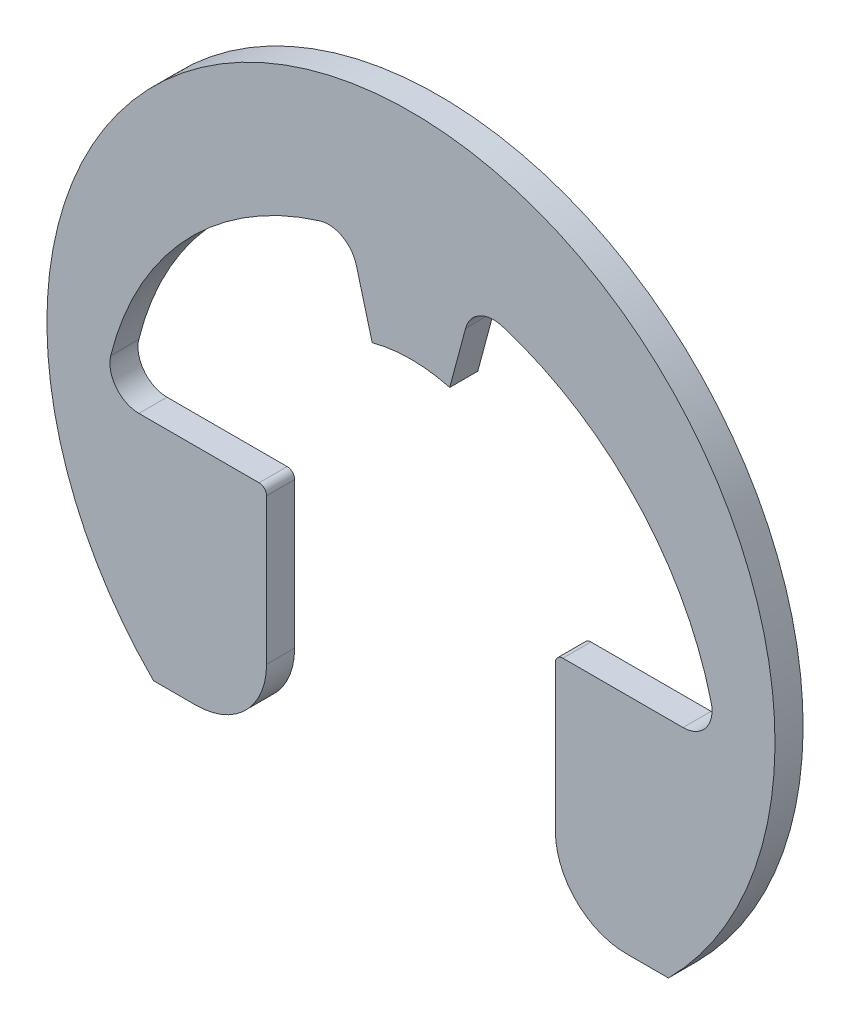
ISO-10303-21;
HEADER;
FILE_DESCRIPTION(('STEP AP214'),'2;1');
FILE_NAME('part.step','',(''),(''),'','','');
FILE_SCHEMA(('AUTOMOTIVE_DESIGN { 1 0 10303 214 1 1 1 1 }'));
ENDSEC;
DATA;
#1=APPLICATION_CONTEXT('core data for automotive mechanical design processes');
#2=APPLICATION_PROTOCOL_DEFINITION('international standard','automotive_design',2000,#1);
#3=PRODUCT_CONTEXT('',#1,'mechanical');
#4=PRODUCT('Part','Part','',(#3));
#5=PRODUCT_RELATED_PRODUCT_CATEGORY('part','',(#4));
#6=PRODUCT_DEFINITION_FORMATION('','',#4);
#7=PRODUCT_DEFINITION_CONTEXT('part definition',#1,'design');
#8=PRODUCT_DEFINITION('design','',#6,#7);
#9=PRODUCT_DEFINITION_SHAPE('','',#8);
#10=(LENGTH_UNIT() NAMED_UNIT(*) SI_UNIT(.MILLI.,.METRE.));
#11=(NAMED_UNIT(*) PLANE_ANGLE_UNIT() SI_UNIT($,.RADIAN.));
#12=(NAMED_UNIT(*) SI_UNIT($,.STERADIAN.) SOLID_ANGLE_UNIT());
#13=UNCERTAINTY_MEASURE_WITH_UNIT(LENGTH_MEASURE(1.E-05),#10,'distance_accuracy_value','');
#14=(GEOMETRIC_REPRESENTATION_CONTEXT(3) GLOBAL_UNCERTAINTY_ASSIGNED_CONTEXT((#13)) GLOBAL_UNIT_ASSIGNED_CONTEXT((#10,
#11,#12)) REPRESENTATION_CONTEXT('',''));
#15=CARTESIAN_POINT('',(0.,0.,0.));
#16=DIRECTION('',(0.,0.,1.));
#17=DIRECTION('',(1.,0.,0.));
#18=AXIS2_PLACEMENT_3D('',#15,#16,#17);
#19=CARTESIAN_POINT('',(-5.81258703439744,-0.0896076013005697,-0.6));
#20=DIRECTION('',(0.,0.,1.));
#21=DIRECTION('',(1.,0.,0.));
#22=AXIS2_PLACEMENT_3D('',#19,#20,#21);
#23=CYLINDRICAL_SURFACE('',#22,0.620024390243903);
#24=CARTESIAN_POINT('',(-5.81258703439744,-0.0896076013005697,0.));
#25=DIRECTION('',(0.,0.,-1.));
#26=DIRECTION('',(1.,0.,0.));
#27=AXIS2_PLACEMENT_3D('',#24,#25,#26);
#28=CIRCLE('',#27,0.620024390243903);
#29=CARTESIAN_POINT('',(-5.81258703439744,-0.709631991544472,0.));
#30=VERTEX_POINT('',#29);
#31=CARTESIAN_POINT('',(-6.41442249649734,0.0594706367367905,0.));
#32=VERTEX_POINT('',#31);
#33=EDGE_CURVE('E202',#30,#32,#28,.T.);
#34=ORIENTED_EDGE('',*,*,#33,.F.);
#35=DIRECTION('',(0.,0.,1.));
#36=VECTOR('',#35,1.);
#37=CARTESIAN_POINT('',(-5.81258703439744,-0.709631991544472,-0.6));
#38=LINE('',#37,#36);
#39=CARTESIAN_POINT('',(-5.81258703439744,-0.709631991544472,-0.6));
#40=VERTEX_POINT('',#39);
#41=EDGE_CURVE('E11',#40,#30,#38,.T.);
#42=ORIENTED_EDGE('',*,*,#41,.F.);
#43=CARTESIAN_POINT('',(-5.81258703439744,-0.0896076013005697,-0.6));
#44=DIRECTION('',(0.,0.,-1.));
#45=DIRECTION('',(1.,0.,0.));
#46=AXIS2_PLACEMENT_3D('',#43,#44,#45);
#47=CIRCLE('',#46,0.620024390243903);
#48=CARTESIAN_POINT('',(-6.41442249649734,0.0594706367367905,-0.6));
#49=VERTEX_POINT('',#48);
#50=EDGE_CURVE('E258',#40,#49,#47,.T.);
#51=ORIENTED_EDGE('',*,*,#50,.T.);
#52=DIRECTION('',(0.,0.,1.));
#53=VECTOR('',#52,1.);
#54=CARTESIAN_POINT('',(-6.41442249649734,0.0594706367367905,-0.6));
#55=LINE('',#54,#53);
#56=EDGE_CURVE('E36',#49,#32,#55,.T.);
#57=ORIENTED_EDGE('',*,*,#56,.T.);
#58=EDGE_LOOP('',(#34,#42,#51,#57));
#59=FACE_BOUND('',#58,.T.);
#60=ADVANCED_FACE('F33',(#59),#23,.F.);
#61=CARTESIAN_POINT('',(-3.24551077633127,-0.709631991544472,-0.6));
#62=DIRECTION('',(0.,1.,0.));
#63=DIRECTION('',(-1.,0.,0.));
#64=AXIS2_PLACEMENT_3D('',#61,#62,#63);
#65=PLANE('',#64);
#66=DIRECTION('',(-1.,0.,0.));
#67=VECTOR('',#66,1.);
#68=CARTESIAN_POINT('',(-3.24551077633127,-0.709631991544472,0.));
#69=LINE('',#68,#67);
#70=CARTESIAN_POINT('',(-3.24551077633127,-0.709631991544472,0.));
#71=VERTEX_POINT('',#70);
#72=EDGE_CURVE('E256',#71,#30,#69,.T.);
#73=ORIENTED_EDGE('',*,*,#72,.F.);
#74=DIRECTION('',(0.,0.,1.));
#75=VECTOR('',#74,1.);
#76=CARTESIAN_POINT('',(-3.24551077633127,-0.709631991544472,-0.6));
#77=LINE('',#76,#75);
#78=CARTESIAN_POINT('',(-3.24551077633127,-0.709631991544472,-0.6));
#79=VERTEX_POINT('',#78);
#80=EDGE_CURVE('E42',#79,#71,#77,.T.);
#81=ORIENTED_EDGE('',*,*,#80,.F.);
#82=DIRECTION('',(-1.,0.,0.));
#83=VECTOR('',#82,1.);
#84=CARTESIAN_POINT('',(-3.24551077633127,-0.709631991544472,-0.6));
#85=LINE('',#84,#83);
#86=EDGE_CURVE('E192',#79,#40,#85,.T.);
#87=ORIENTED_EDGE('',*,*,#86,.T.);
#88=ORIENTED_EDGE('',*,*,#41,.T.);
#89=EDGE_LOOP('',(#73,#81,#87,#88));
#90=FACE_BOUND('',#89,.T.);
#91=ADVANCED_FACE('F294',(#90),#65,.T.);
#92=CARTESIAN_POINT('',(-3.24551077633127,-0.869631991544472,-0.6));
#93=DIRECTION('',(0.,0.,1.));
#94=DIRECTION('',(1.,0.,0.));
#95=AXIS2_PLACEMENT_3D('',#92,#93,#94);
#96=CYLINDRICAL_SURFACE('',#95,0.16);
#97=CARTESIAN_POINT('',(-3.24551077633127,-0.869631991544472,0.));
#98=DIRECTION('',(0.,0.,1.));
#99=DIRECTION('',(1.,0.,0.));
#100=AXIS2_PLACEMENT_3D('',#97,#98,#99);
#101=CIRCLE('',#100,0.16);
#102=CARTESIAN_POINT('',(-3.08551077633127,-0.869631991544472,0.));
#103=VERTEX_POINT('',#102);
#104=EDGE_CURVE('E179',#103,#71,#101,.T.);
#105=ORIENTED_EDGE('',*,*,#104,.F.);
#106=DIRECTION('',(0.,0.,1.));
#107=VECTOR('',#106,1.);
#108=CARTESIAN_POINT('',(-3.08551077633127,-0.869631991544472,-0.6));
#109=LINE('',#108,#107);
#110=CARTESIAN_POINT('',(-3.08551077633127,-0.869631991544472,-0.6));
#111=VERTEX_POINT('',#110);
#112=EDGE_CURVE('E174',#111,#103,#109,.T.);
#113=ORIENTED_EDGE('',*,*,#112,.F.);
#114=CARTESIAN_POINT('',(-3.24551077633127,-0.869631991544472,-0.6));
#115=DIRECTION('',(0.,0.,1.));
#116=DIRECTION('',(1.,0.,0.));
#117=AXIS2_PLACEMENT_3D('',#114,#115,#116);
#118=CIRCLE('',#117,0.16);
#119=EDGE_CURVE('E177',#111,#79,#118,.T.);
#120=ORIENTED_EDGE('',*,*,#119,.T.);
#121=ORIENTED_EDGE('',*,*,#80,.T.);
#122=EDGE_LOOP('',(#105,#113,#120,#121));
#123=FACE_BOUND('',#122,.T.);
#124=ADVANCED_FACE('F176',(#123),#96,.T.);
#125=CARTESIAN_POINT('',(-3.08551077633127,-0.869631991544472,-0.6));
#126=DIRECTION('',(1.,0.,0.));
#127=DIRECTION('',(0.,1.,0.));
#128=AXIS2_PLACEMENT_3D('',#125,#126,#127);
#129=PLANE('',#128);
#130=DIRECTION('',(0.,1.,0.));
#131=VECTOR('',#130,1.);
#132=CARTESIAN_POINT('',(-3.08551077633127,-0.869631991544472,0.));
#133=LINE('',#132,#131);
#134=CARTESIAN_POINT('',(-3.08551077633127,-3.98946153040072,0.));
#135=VERTEX_POINT('',#134);
#136=EDGE_CURVE('E253',#135,#103,#133,.T.);
#137=ORIENTED_EDGE('',*,*,#136,.F.);
#138=DIRECTION('',(0.,0.,1.));
#139=VECTOR('',#138,1.);
#140=CARTESIAN_POINT('',(-3.08551077633127,-3.98946153040072,-0.6));
#141=LINE('',#140,#139);
#142=CARTESIAN_POINT('',(-3.08551077633127,-3.98946153040072,-0.6));
#143=VERTEX_POINT('',#142);
#144=EDGE_CURVE('E184',#143,#135,#141,.T.);
#145=ORIENTED_EDGE('',*,*,#144,.F.);
#146=DIRECTION('',(0.,1.,0.));
#147=VECTOR('',#146,1.);
#148=CARTESIAN_POINT('',(-3.08551077633127,-0.869631991544472,-0.6));
#149=LINE('',#148,#147);
#150=EDGE_CURVE('E190',#143,#111,#149,.T.);
#151=ORIENTED_EDGE('',*,*,#150,.T.);
#152=ORIENTED_EDGE('',*,*,#112,.T.);
#153=EDGE_LOOP('',(#137,#145,#151,#152));
#154=FACE_BOUND('',#153,.T.);
#155=ADVANCED_FACE('F194',(#154),#129,.T.);
#156=CARTESIAN_POINT('',(-4.59653516657517,-3.98946153040072,-0.6));
#157=DIRECTION('',(0.,0.,1.));
#158=DIRECTION('',(1.,0.,0.));
#159=AXIS2_PLACEMENT_3D('',#156,#157,#158);
#160=CYLINDRICAL_SURFACE('',#159,1.5110243902439);
#161=CARTESIAN_POINT('',(-4.59653516657517,-3.98946153040072,0.));
#162=DIRECTION('',(0.,0.,1.));
#163=DIRECTION('',(1.,0.,0.));
#164=AXIS2_PLACEMENT_3D('',#161,#162,#163);
#165=CIRCLE('',#164,1.5110243902439);
#166=CARTESIAN_POINT('',(-4.59653516657517,-5.50048592064462,0.));
#167=VERTEX_POINT('',#166);
#168=EDGE_CURVE('E250',#167,#135,#165,.T.);
#169=ORIENTED_EDGE('',*,*,#168,.F.);
#170=DIRECTION('',(0.,0.,1.));
#171=VECTOR('',#170,1.);
#172=CARTESIAN_POINT('',(-4.59653516657517,-5.50048592064462,-0.6));
#173=LINE('',#172,#171);
#174=CARTESIAN_POINT('',(-4.59653516657517,-5.50048592064462,-0.6));
#175=VERTEX_POINT('',#174);
#176=EDGE_CURVE('E262',#175,#167,#173,.T.);
#177=ORIENTED_EDGE('',*,*,#176,.F.);
#178=CARTESIAN_POINT('',(-4.59653516657517,-3.98946153040072,-0.6));
#179=DIRECTION('',(0.,0.,1.));
#180=DIRECTION('',(1.,0.,0.));
#181=AXIS2_PLACEMENT_3D('',#178,#179,#180);
#182=CIRCLE('',#181,1.5110243902439);
#183=EDGE_CURVE('E195',#175,#143,#182,.T.);
#184=ORIENTED_EDGE('',*,*,#183,.T.);
#185=ORIENTED_EDGE('',*,*,#144,.T.);
#186=EDGE_LOOP('',(#169,#177,#184,#185));
#187=FACE_BOUND('',#186,.T.);
#188=ADVANCED_FACE('F307',(#187),#160,.T.);
#189=CARTESIAN_POINT('',(-4.59653516657517,-5.50048592064462,-0.6));
#190=DIRECTION('',(0.,-1.,0.));
#191=DIRECTION('',(1.,0.,0.));
#192=AXIS2_PLACEMENT_3D('',#189,#190,#191);
#193=PLANE('',#192);
#194=DIRECTION('',(1.,0.,0.));
#195=VECTOR('',#194,1.);
#196=CARTESIAN_POINT('',(-4.59653516657517,-5.50048592064462,0.));
#197=LINE('',#196,#195);
#198=CARTESIAN_POINT('',(-5.50048592064462,-5.50048592064463,0.));
#199=VERTEX_POINT('',#198);
#200=EDGE_CURVE('E247',#199,#167,#197,.T.);
#201=ORIENTED_EDGE('',*,*,#200,.F.);
#202=DIRECTION('',(0.,0.,1.));
#203=VECTOR('',#202,1.);
#204=CARTESIAN_POINT('',(-5.50048592064462,-5.50048592064463,-0.6));
#205=LINE('',#204,#203);
#206=CARTESIAN_POINT('',(-5.50048592064462,-5.50048592064463,-0.6));
#207=VERTEX_POINT('',#206);
#208=EDGE_CURVE('E264',#207,#199,#205,.T.);
#209=ORIENTED_EDGE('',*,*,#208,.F.);
#210=DIRECTION('',(1.,0.,0.));
#211=VECTOR('',#210,1.);
#212=CARTESIAN_POINT('',(-4.59653516657517,-5.50048592064462,-0.6));
#213=LINE('',#212,#211);
#214=EDGE_CURVE('E197',#207,#175,#213,.T.);
#215=ORIENTED_EDGE('',*,*,#214,.T.);
#216=ORIENTED_EDGE('',*,*,#176,.T.);
#217=EDGE_LOOP('',(#201,#209,#215,#216));
#218=FACE_BOUND('',#217,.T.);
#219=ADVANCED_FACE('F310',(#218),#193,.T.);
#220=CARTESIAN_POINT('',(0.,0.,-0.6));
#221=DIRECTION('',(0.,0.,1.));
#222=DIRECTION('',(1.,0.,0.));
#223=AXIS2_PLACEMENT_3D('',#220,#221,#222);
#224=CYLINDRICAL_SURFACE('',#223,7.77886178861788);
#225=CARTESIAN_POINT('',(0.,0.,0.));
#226=DIRECTION('',(0.,0.,1.));
#227=DIRECTION('',(1.,0.,0.));
#228=AXIS2_PLACEMENT_3D('',#225,#226,#227);
#229=CIRCLE('',#228,7.77886178861788);
#230=CARTESIAN_POINT('',(5.50048592064462,-5.50048592064462,0.));
#231=VERTEX_POINT('',#230);
#232=EDGE_CURVE('E244',#231,#199,#229,.T.);
#233=ORIENTED_EDGE('',*,*,#232,.F.);
#234=DIRECTION('',(0.,0.,1.));
#235=VECTOR('',#234,1.);
#236=CARTESIAN_POINT('',(5.50048592064462,-5.50048592064462,-0.6));
#237=LINE('',#236,#235);
#238=CARTESIAN_POINT('',(5.50048592064462,-5.50048592064462,-0.6));
#239=VERTEX_POINT('',#238);
#240=EDGE_CURVE('E266',#239,#231,#237,.T.);
#241=ORIENTED_EDGE('',*,*,#240,.F.);
#242=CARTESIAN_POINT('',(0.,0.,-0.6));
#243=DIRECTION('',(0.,0.,1.));
#244=DIRECTION('',(1.,0.,0.));
#245=AXIS2_PLACEMENT_3D('',#242,#243,#244);
#246=CIRCLE('',#245,7.77886178861788);
#247=EDGE_CURVE('E549',#239,#207,#246,.T.);
#248=ORIENTED_EDGE('',*,*,#247,.T.);
#249=ORIENTED_EDGE('',*,*,#208,.T.);
#250=EDGE_LOOP('',(#233,#241,#248,#249));
#251=FACE_BOUND('',#250,.T.);
#252=ADVANCED_FACE('F314',(#251),#224,.T.);
#253=CARTESIAN_POINT('',(5.50048592064462,-5.50048592064462,-0.6));
#254=DIRECTION('',(0.,-1.,0.));
#255=DIRECTION('',(1.,0.,0.));
#256=AXIS2_PLACEMENT_3D('',#253,#254,#255);
#257=PLANE('',#256);
#258=DIRECTION('',(1.,0.,0.));
#259=VECTOR('',#258,1.);
#260=CARTESIAN_POINT('',(5.50048592064462,-5.50048592064462,0.));
#261=LINE('',#260,#259);
#262=CARTESIAN_POINT('',(4.59653516657517,-5.50048592064462,0.));
#263=VERTEX_POINT('',#262);
#264=EDGE_CURVE('E241',#263,#231,#261,.T.);
#265=ORIENTED_EDGE('',*,*,#264,.F.);
#266=DIRECTION('',(0.,0.,1.));
#267=VECTOR('',#266,1.);
#268=CARTESIAN_POINT('',(4.59653516657517,-5.50048592064462,-0.6));
#269=LINE('',#268,#267);
#270=CARTESIAN_POINT('',(4.59653516657517,-5.50048592064462,-0.6));
#271=VERTEX_POINT('',#270);
#272=EDGE_CURVE('E268',#271,#263,#269,.T.);
#273=ORIENTED_EDGE('',*,*,#272,.F.);
#274=DIRECTION('',(1.,0.,0.));
#275=VECTOR('',#274,1.);
#276=CARTESIAN_POINT('',(5.50048592064462,-5.50048592064462,-0.6));
#277=LINE('',#276,#275);
#278=EDGE_CURVE('E542',#271,#239,#277,.T.);
#279=ORIENTED_EDGE('',*,*,#278,.T.);
#280=ORIENTED_EDGE('',*,*,#240,.T.);
#281=EDGE_LOOP('',(#265,#273,#279,#280));
#282=FACE_BOUND('',#281,.T.);
#283=ADVANCED_FACE('F318',(#282),#257,.T.);
#284=CARTESIAN_POINT('',(4.59653516657517,-3.98946153040072,-0.6));
#285=DIRECTION('',(0.,0.,1.));
#286=DIRECTION('',(1.,0.,0.));
#287=AXIS2_PLACEMENT_3D('',#284,#285,#286);
#288=CYLINDRICAL_SURFACE('',#287,1.5110243902439);
#289=CARTESIAN_POINT('',(4.59653516657517,-3.98946153040072,0.));
#290=DIRECTION('',(0.,0.,1.));
#291=DIRECTION('',(1.,0.,0.));
#292=AXIS2_PLACEMENT_3D('',#289,#290,#291);
#293=CIRCLE('',#292,1.5110243902439);
#294=CARTESIAN_POINT('',(3.08551077633127,-3.98946153040072,0.));
#295=VERTEX_POINT('',#294);
#296=EDGE_CURVE('E238',#295,#263,#293,.T.);
#297=ORIENTED_EDGE('',*,*,#296,.F.);
#298=DIRECTION('',(0.,0.,1.));
#299=VECTOR('',#298,1.);
#300=CARTESIAN_POINT('',(3.08551077633127,-3.98946153040072,-0.6));
#301=LINE('',#300,#299);
#302=CARTESIAN_POINT('',(3.08551077633127,-3.98946153040072,-0.6));
#303=VERTEX_POINT('',#302);
#304=EDGE_CURVE('E270',#303,#295,#301,.T.);
#305=ORIENTED_EDGE('',*,*,#304,.F.);
#306=CARTESIAN_POINT('',(4.59653516657517,-3.98946153040072,-0.6));
#307=DIRECTION('',(0.,0.,1.));
#308=DIRECTION('',(1.,0.,0.));
#309=AXIS2_PLACEMENT_3D('',#306,#307,#308);
#310=CIRCLE('',#309,1.5110243902439);
#311=EDGE_CURVE('E538',#303,#271,#310,.T.);
#312=ORIENTED_EDGE('',*,*,#311,.T.);
#313=ORIENTED_EDGE('',*,*,#272,.T.);
#314=EDGE_LOOP('',(#297,#305,#312,#313));
#315=FACE_BOUND('',#314,.T.);
#316=ADVANCED_FACE('F322',(#315),#288,.T.);
#317=CARTESIAN_POINT('',(3.08551077633127,-0.869631991544472,-0.6));
#318=DIRECTION('',(-1.,0.,0.));
#319=DIRECTION('',(0.,-1.,0.));
#320=AXIS2_PLACEMENT_3D('',#317,#318,#319);
#321=PLANE('',#320);
#322=DIRECTION('',(0.,-1.,0.));
#323=VECTOR('',#322,1.);
#324=CARTESIAN_POINT('',(3.08551077633127,-0.869631991544472,0.));
#325=LINE('',#324,#323);
#326=CARTESIAN_POINT('',(3.08551077633127,-0.869631991544472,0.));
#327=VERTEX_POINT('',#326);
#328=EDGE_CURVE('E235',#327,#295,#325,.T.);
#329=ORIENTED_EDGE('',*,*,#328,.F.);
#330=DIRECTION('',(0.,0.,1.));
#331=VECTOR('',#330,1.);
#332=CARTESIAN_POINT('',(3.08551077633127,-0.869631991544472,-0.6));
#333=LINE('',#332,#331);
#334=CARTESIAN_POINT('',(3.08551077633127,-0.869631991544472,-0.6));
#335=VERTEX_POINT('',#334);
#336=EDGE_CURVE('E272',#335,#327,#333,.T.);
#337=ORIENTED_EDGE('',*,*,#336,.F.);
#338=DIRECTION('',(0.,-1.,0.));
#339=VECTOR('',#338,1.);
#340=CARTESIAN_POINT('',(3.08551077633127,-0.869631991544472,-0.6));
#341=LINE('',#340,#339);
#342=EDGE_CURVE('E554',#335,#303,#341,.T.);
#343=ORIENTED_EDGE('',*,*,#342,.T.);
#344=ORIENTED_EDGE('',*,*,#304,.T.);
#345=EDGE_LOOP('',(#329,#337,#343,#344));
#346=FACE_BOUND('',#345,.T.);
#347=ADVANCED_FACE('F326',(#346),#321,.T.);
#348=CARTESIAN_POINT('',(3.24551077633127,-0.869631991544472,-0.6));
#349=DIRECTION('',(0.,0.,1.));
#350=DIRECTION('',(1.,0.,0.));
#351=AXIS2_PLACEMENT_3D('',#348,#349,#350);
#352=CYLINDRICAL_SURFACE('',#351,0.16);
#353=CARTESIAN_POINT('',(3.24551077633127,-0.869631991544472,0.));
#354=DIRECTION('',(0.,0.,1.));
#355=DIRECTION('',(1.,0.,0.));
#356=AXIS2_PLACEMENT_3D('',#353,#354,#355);
#357=CIRCLE('',#356,0.16);
#358=CARTESIAN_POINT('',(3.24551077633127,-0.709631991544472,0.));
#359=VERTEX_POINT('',#358);
#360=EDGE_CURVE('E232',#359,#327,#357,.T.);
#361=ORIENTED_EDGE('',*,*,#360,.F.);
#362=DIRECTION('',(0.,0.,1.));
#363=VECTOR('',#362,1.);
#364=CARTESIAN_POINT('',(3.24551077633127,-0.709631991544472,-0.6));
#365=LINE('',#364,#363);
#366=CARTESIAN_POINT('',(3.24551077633127,-0.709631991544472,-0.6));
#367=VERTEX_POINT('',#366);
#368=EDGE_CURVE('E274',#367,#359,#365,.T.);
#369=ORIENTED_EDGE('',*,*,#368,.F.);
#370=CARTESIAN_POINT('',(3.24551077633127,-0.869631991544472,-0.6));
#371=DIRECTION('',(0.,0.,1.));
#372=DIRECTION('',(1.,0.,0.));
#373=AXIS2_PLACEMENT_3D('',#370,#371,#372);
#374=CIRCLE('',#373,0.16);
#375=EDGE_CURVE('E531',#367,#335,#374,.T.);
#376=ORIENTED_EDGE('',*,*,#375,.T.);
#377=ORIENTED_EDGE('',*,*,#336,.T.);
#378=EDGE_LOOP('',(#361,#369,#376,#377));
#379=FACE_BOUND('',#378,.T.);
#380=ADVANCED_FACE('F330',(#379),#352,.T.);
#381=CARTESIAN_POINT('',(3.24551077633127,-0.709631991544472,-0.6));
#382=DIRECTION('',(0.,1.,0.));
#383=DIRECTION('',(-1.,0.,0.));
#384=AXIS2_PLACEMENT_3D('',#381,#382,#383);
#385=PLANE('',#384);
#386=DIRECTION('',(-1.,0.,0.));
#387=VECTOR('',#386,1.);
#388=CARTESIAN_POINT('',(3.24551077633127,-0.709631991544472,0.));
#389=LINE('',#388,#387);
#390=CARTESIAN_POINT('',(5.81258703439744,-0.709631991544472,0.));
#391=VERTEX_POINT('',#390);
#392=EDGE_CURVE('E229',#391,#359,#389,.T.);
#393=ORIENTED_EDGE('',*,*,#392,.F.);
#394=DIRECTION('',(0.,0.,1.));
#395=VECTOR('',#394,1.);
#396=CARTESIAN_POINT('',(5.81258703439744,-0.709631991544472,-0.6));
#397=LINE('',#396,#395);
#398=CARTESIAN_POINT('',(5.81258703439744,-0.709631991544472,-0.6));
#399=VERTEX_POINT('',#398);
#400=EDGE_CURVE('E276',#399,#391,#397,.T.);
#401=ORIENTED_EDGE('',*,*,#400,.F.);
#402=DIRECTION('',(-1.,0.,0.));
#403=VECTOR('',#402,1.);
#404=CARTESIAN_POINT('',(3.24551077633127,-0.709631991544472,-0.6));
#405=LINE('',#404,#403);
#406=EDGE_CURVE('E527',#399,#367,#405,.T.);
#407=ORIENTED_EDGE('',*,*,#406,.T.);
#408=ORIENTED_EDGE('',*,*,#368,.T.);
#409=EDGE_LOOP('',(#393,#401,#407,#408));
#410=FACE_BOUND('',#409,.T.);
#411=ADVANCED_FACE('F334',(#410),#385,.T.);
#412=CARTESIAN_POINT('',(5.81258703439744,-0.0896076013005694,-0.6));
#413=DIRECTION('',(0.,0.,1.));
#414=DIRECTION('',(1.,0.,0.));
#415=AXIS2_PLACEMENT_3D('',#412,#413,#414);
#416=CYLINDRICAL_SURFACE('',#415,0.620024390243903);
#417=CARTESIAN_POINT('',(5.81258703439744,-0.0896076013005694,0.));
#418=DIRECTION('',(0.,0.,-1.));
#419=DIRECTION('',(1.,0.,0.));
#420=AXIS2_PLACEMENT_3D('',#417,#418,#419);
#421=CIRCLE('',#420,0.620024390243903);
#422=CARTESIAN_POINT('',(6.41442249649734,0.0594706367367914,0.));
#423=VERTEX_POINT('',#422);
#424=EDGE_CURVE('E226',#423,#391,#421,.T.);
#425=ORIENTED_EDGE('',*,*,#424,.F.);
#426=DIRECTION('',(0.,0.,1.));
#427=VECTOR('',#426,1.);
#428=CARTESIAN_POINT('',(6.41442249649734,0.0594706367367914,-0.6));
#429=LINE('',#428,#427);
#430=CARTESIAN_POINT('',(6.41442249649734,0.0594706367367914,-0.6));
#431=VERTEX_POINT('',#430);
#432=EDGE_CURVE('E278',#431,#423,#429,.T.);
#433=ORIENTED_EDGE('',*,*,#432,.F.);
#434=CARTESIAN_POINT('',(5.81258703439744,-0.0896076013005694,-0.6));
#435=DIRECTION('',(0.,0.,-1.));
#436=DIRECTION('',(1.,0.,0.));
#437=AXIS2_PLACEMENT_3D('',#434,#435,#436);
#438=CIRCLE('',#437,0.620024390243903);
#439=EDGE_CURVE('E558',#431,#399,#438,.T.);
#440=ORIENTED_EDGE('',*,*,#439,.T.);
#441=ORIENTED_EDGE('',*,*,#400,.T.);
#442=EDGE_LOOP('',(#425,#433,#440,#441));
#443=FACE_BOUND('',#442,.T.);
#444=ADVANCED_FACE('F338',(#443),#416,.F.);
#445=CARTESIAN_POINT('',(0.,-1.5294201216584,-0.6));
#446=DIRECTION('',(0.,0.,1.));
#447=DIRECTION('',(1.,0.,0.));
#448=AXIS2_PLACEMENT_3D('',#445,#446,#447);
#449=CYLINDRICAL_SURFACE('',#448,6.60828191027628);
#450=CARTESIAN_POINT('',(0.,-1.5294201216584,0.));
#451=DIRECTION('',(0.,0.,-1.));
#452=DIRECTION('',(-1.,0.,0.));
#453=AXIS2_PLACEMENT_3D('',#450,#451,#452);
#454=CIRCLE('',#453,6.60828191027628);
#455=CARTESIAN_POINT('',(1.94811361614149,4.78518541980568,0.));
#456=VERTEX_POINT('',#455);
#457=EDGE_CURVE('E223',#456,#423,#454,.T.);
#458=ORIENTED_EDGE('',*,*,#457,.F.);
#459=DIRECTION('',(0.,0.,1.));
#460=VECTOR('',#459,1.);
#461=CARTESIAN_POINT('',(1.94811361614149,4.78518541980568,-0.6));
#462=LINE('',#461,#460);
#463=CARTESIAN_POINT('',(1.94811361614149,4.78518541980568,-0.6));
#464=VERTEX_POINT('',#463);
#465=EDGE_CURVE('E280',#464,#456,#462,.T.);
#466=ORIENTED_EDGE('',*,*,#465,.F.);
#467=CARTESIAN_POINT('',(0.,-1.5294201216584,-0.6));
#468=DIRECTION('',(0.,0.,-1.));
#469=DIRECTION('',(-1.,0.,0.));
#470=AXIS2_PLACEMENT_3D('',#467,#468,#469);
#471=CIRCLE('',#470,6.60828191027628);
#472=EDGE_CURVE('E520',#464,#431,#471,.T.);
#473=ORIENTED_EDGE('',*,*,#472,.T.);
#474=ORIENTED_EDGE('',*,*,#432,.T.);
#475=EDGE_LOOP('',(#458,#466,#473,#474));
#476=FACE_BOUND('',#475,.T.);
#477=ADVANCED_FACE('F342',(#476),#449,.F.);
#478=CARTESIAN_POINT('',(1.7653311662742,4.19271531885726,-0.6));
#479=DIRECTION('',(0.,0.,1.));
#480=DIRECTION('',(1.,0.,0.));
#481=AXIS2_PLACEMENT_3D('',#478,#479,#480);
#482=CYLINDRICAL_SURFACE('',#481,0.620024390243903);
#483=CARTESIAN_POINT('',(1.7653311662742,4.19271531885726,0.));
#484=DIRECTION('',(0.,0.,-1.));
#485=DIRECTION('',(1.,0.,0.));
#486=AXIS2_PLACEMENT_3D('',#483,#484,#485);
#487=CIRCLE('',#486,0.620024390243903);
#488=CARTESIAN_POINT('',(1.16643359480849,4.35318943948046,0.));
#489=VERTEX_POINT('',#488);
#490=EDGE_CURVE('E220',#489,#456,#487,.T.);
#491=ORIENTED_EDGE('',*,*,#490,.F.);
#492=DIRECTION('',(0.,0.,1.));
#493=VECTOR('',#492,1.);
#494=CARTESIAN_POINT('',(1.16643359480849,4.35318943948046,-0.6));
#495=LINE('',#494,#493);
#496=CARTESIAN_POINT('',(1.16643359480849,4.35318943948046,-0.6));
#497=VERTEX_POINT('',#496);
#498=EDGE_CURVE('E282',#497,#489,#495,.T.);
#499=ORIENTED_EDGE('',*,*,#498,.F.);
#500=CARTESIAN_POINT('',(1.7653311662742,4.19271531885726,-0.6));
#501=DIRECTION('',(0.,0.,-1.));
#502=DIRECTION('',(1.,0.,0.));
#503=AXIS2_PLACEMENT_3D('',#500,#501,#502);
#504=CIRCLE('',#503,0.620024390243903);
#505=EDGE_CURVE('E516',#497,#464,#504,.T.);
#506=ORIENTED_EDGE('',*,*,#505,.T.);
#507=ORIENTED_EDGE('',*,*,#465,.T.);
#508=EDGE_LOOP('',(#491,#499,#506,#507));
#509=FACE_BOUND('',#508,.T.);
#510=ADVANCED_FACE('F346',(#509),#482,.F.);
#511=CARTESIAN_POINT('',(1.16643359480849,4.35318943948046,-0.6));
#512=DIRECTION('',(0.965925826289068,-0.258819045102521,0.));
#513=DIRECTION('',(0.258819045102522,0.965925826289068,0.));
#514=AXIS2_PLACEMENT_3D('',#511,#512,#513);
#515=PLANE('',#514);
#516=DIRECTION('',(0.258819045102521,0.965925826289068,0.));
#517=VECTOR('',#516,1.);
#518=CARTESIAN_POINT('',(1.16643359480849,4.35318943948046,0.));
#519=LINE('',#518,#517);
#520=CARTESIAN_POINT('',(0.828220944328069,3.09096264412502,0.));
#521=VERTEX_POINT('',#520);
#522=EDGE_CURVE('E217',#521,#489,#519,.T.);
#523=ORIENTED_EDGE('',*,*,#522,.F.);
#524=DIRECTION('',(0.,0.,1.));
#525=VECTOR('',#524,1.);
#526=CARTESIAN_POINT('',(0.828220944328069,3.09096264412502,-0.6));
#527=LINE('',#526,#525);
#528=CARTESIAN_POINT('',(0.828220944328069,3.09096264412502,-0.6));
#529=VERTEX_POINT('',#528);
#530=EDGE_CURVE('E284',#529,#521,#527,.T.);
#531=ORIENTED_EDGE('',*,*,#530,.F.);
#532=DIRECTION('',(0.258819045102521,0.965925826289068,0.));
#533=VECTOR('',#532,1.);
#534=CARTESIAN_POINT('',(1.16643359480849,4.35318943948046,-0.6));
#535=LINE('',#534,#533);
#536=EDGE_CURVE('E562',#529,#497,#535,.T.);
#537=ORIENTED_EDGE('',*,*,#536,.T.);
#538=ORIENTED_EDGE('',*,*,#498,.T.);
#539=EDGE_LOOP('',(#523,#531,#537,#538));
#540=FACE_BOUND('',#539,.T.);
#541=ADVANCED_FACE('F350',(#540),#515,.T.);
#542=CARTESIAN_POINT('',(0.,0.,-0.6));
#543=DIRECTION('',(0.,0.,1.));
#544=DIRECTION('',(1.,0.,0.));
#545=AXIS2_PLACEMENT_3D('',#542,#543,#544);
#546=CYLINDRICAL_SURFACE('',#545,3.2);
#547=CARTESIAN_POINT('',(0.,0.,0.));
#548=DIRECTION('',(0.,0.,-1.));
#549=DIRECTION('',(-1.,0.,0.));
#550=AXIS2_PLACEMENT_3D('',#547,#548,#549);
#551=CIRCLE('',#550,3.2);
#552=CARTESIAN_POINT('',(-0.828220944328069,3.09096264412502,0.));
#553=VERTEX_POINT('',#552);
#554=EDGE_CURVE('E214',#553,#521,#551,.T.);
#555=ORIENTED_EDGE('',*,*,#554,.F.);
#556=DIRECTION('',(0.,0.,1.));
#557=VECTOR('',#556,1.);
#558=CARTESIAN_POINT('',(-0.828220944328069,3.09096264412502,-0.6));
#559=LINE('',#558,#557);
#560=CARTESIAN_POINT('',(-0.828220944328069,3.09096264412502,-0.6));
#561=VERTEX_POINT('',#560);
#562=EDGE_CURVE('E286',#561,#553,#559,.T.);
#563=ORIENTED_EDGE('',*,*,#562,.F.);
#564=CARTESIAN_POINT('',(0.,0.,-0.6));
#565=DIRECTION('',(0.,0.,-1.));
#566=DIRECTION('',(-1.,0.,0.));
#567=AXIS2_PLACEMENT_3D('',#564,#565,#566);
#568=CIRCLE('',#567,3.2);
#569=EDGE_CURVE('E509',#561,#529,#568,.T.);
#570=ORIENTED_EDGE('',*,*,#569,.T.);
#571=ORIENTED_EDGE('',*,*,#530,.T.);
#572=EDGE_LOOP('',(#555,#563,#570,#571));
#573=FACE_BOUND('',#572,.T.);
#574=ADVANCED_FACE('F354',(#573),#546,.F.);
#575=CARTESIAN_POINT('',(-1.16643359480849,4.35318943948046,-0.6));
#576=DIRECTION('',(-0.965925826289068,-0.258819045102521,0.));
#577=DIRECTION('',(0.258819045102522,-0.965925826289068,0.));
#578=AXIS2_PLACEMENT_3D('',#575,#576,#577);
#579=PLANE('',#578);
#580=DIRECTION('',(0.258819045102521,-0.965925826289068,0.));
#581=VECTOR('',#580,1.);
#582=CARTESIAN_POINT('',(-1.16643359480849,4.35318943948046,0.));
#583=LINE('',#582,#581);
#584=CARTESIAN_POINT('',(-1.16643359480848,4.35318943948046,0.));
#585=VERTEX_POINT('',#584);
#586=EDGE_CURVE('E211',#585,#553,#583,.T.);
#587=ORIENTED_EDGE('',*,*,#586,.F.);
#588=DIRECTION('',(0.,0.,1.));
#589=VECTOR('',#588,1.);
#590=CARTESIAN_POINT('',(-1.16643359480848,4.35318943948046,-0.6));
#591=LINE('',#590,#589);
#592=CARTESIAN_POINT('',(-1.16643359480848,4.35318943948046,-0.6));
#593=VERTEX_POINT('',#592);
#594=EDGE_CURVE('E288',#593,#585,#591,.T.);
#595=ORIENTED_EDGE('',*,*,#594,.F.);
#596=DIRECTION('',(0.258819045102521,-0.965925826289068,0.));
#597=VECTOR('',#596,1.);
#598=CARTESIAN_POINT('',(-1.16643359480849,4.35318943948046,-0.6));
#599=LINE('',#598,#597);
#600=EDGE_CURVE('E505',#593,#561,#599,.T.);
#601=ORIENTED_EDGE('',*,*,#600,.T.);
#602=ORIENTED_EDGE('',*,*,#562,.T.);
#603=EDGE_LOOP('',(#587,#595,#601,#602));
#604=FACE_BOUND('',#603,.T.);
#605=ADVANCED_FACE('F358',(#604),#579,.T.);
#606=CARTESIAN_POINT('',(-1.7653311662742,4.19271531885726,-0.6));
#607=DIRECTION('',(0.,0.,1.));
#608=DIRECTION('',(1.,0.,0.));
#609=AXIS2_PLACEMENT_3D('',#606,#607,#608);
#610=CYLINDRICAL_SURFACE('',#609,0.620024390243903);
#611=CARTESIAN_POINT('',(-1.7653311662742,4.19271531885726,0.));
#612=DIRECTION('',(0.,0.,-1.));
#613=DIRECTION('',(1.,0.,0.));
#614=AXIS2_PLACEMENT_3D('',#611,#612,#613);
#615=CIRCLE('',#614,0.620024390243903);
#616=CARTESIAN_POINT('',(-1.94811361614149,4.78518541980568,0.));
#617=VERTEX_POINT('',#616);
#618=EDGE_CURVE('E208',#617,#585,#615,.T.);
#619=ORIENTED_EDGE('',*,*,#618,.F.);
#620=DIRECTION('',(0.,0.,1.));
#621=VECTOR('',#620,1.);
#622=CARTESIAN_POINT('',(-1.94811361614149,4.78518541980568,-0.6));
#623=LINE('',#622,#621);
#624=CARTESIAN_POINT('',(-1.94811361614149,4.78518541980568,-0.6));
#625=VERTEX_POINT('',#624);
#626=EDGE_CURVE('E289',#625,#617,#623,.T.);
#627=ORIENTED_EDGE('',*,*,#626,.F.);
#628=CARTESIAN_POINT('',(-1.7653311662742,4.19271531885726,-0.6));
#629=DIRECTION('',(0.,0.,-1.));
#630=DIRECTION('',(1.,0.,0.));
#631=AXIS2_PLACEMENT_3D('',#628,#629,#630);
#632=CIRCLE('',#631,0.620024390243903);
#633=EDGE_CURVE('E566',#625,#593,#632,.T.);
#634=ORIENTED_EDGE('',*,*,#633,.T.);
#635=ORIENTED_EDGE('',*,*,#594,.T.);
#636=EDGE_LOOP('',(#619,#627,#634,#635));
#637=FACE_BOUND('',#636,.T.);
#638=ADVANCED_FACE('F362',(#637),#610,.F.);
#639=CARTESIAN_POINT('',(0.,-1.5294201216584,-0.6));
#640=DIRECTION('',(0.,0.,1.));
#641=DIRECTION('',(1.,0.,0.));
#642=AXIS2_PLACEMENT_3D('',#639,#640,#641);
#643=CYLINDRICAL_SURFACE('',#642,6.60828191027628);
#644=CARTESIAN_POINT('',(0.,-1.5294201216584,0.));
#645=DIRECTION('',(0.,0.,-1.));
#646=DIRECTION('',(-1.,0.,0.));
#647=AXIS2_PLACEMENT_3D('',#644,#645,#646);
#648=CIRCLE('',#647,6.60828191027628);
#649=EDGE_CURVE('E205',#32,#617,#648,.T.);
#650=ORIENTED_EDGE('',*,*,#649,.F.);
#651=ORIENTED_EDGE('',*,*,#56,.F.);
#652=CARTESIAN_POINT('',(0.,-1.5294201216584,-0.6));
#653=DIRECTION('',(0.,0.,-1.));
#654=DIRECTION('',(-1.,0.,0.));
#655=AXIS2_PLACEMENT_3D('',#652,#653,#654);
#656=CIRCLE('',#655,6.60828191027628);
#657=EDGE_CURVE('E568',#49,#625,#656,.T.);
#658=ORIENTED_EDGE('',*,*,#657,.T.);
#659=ORIENTED_EDGE('',*,*,#626,.T.);
#660=EDGE_LOOP('',(#650,#651,#658,#659));
#661=FACE_BOUND('',#660,.T.);
#662=ADVANCED_FACE('F291',(#661),#643,.F.);
#663=CARTESIAN_POINT('',(-5.81258703439744,-0.0896076013005697,-0.6));
#664=DIRECTION('',(0.,0.,1.));
#665=DIRECTION('',(1.,0.,0.));
#666=AXIS2_PLACEMENT_3D('',#663,#664,#665);
#667=PLANE('',#666);
#668=ORIENTED_EDGE('',*,*,#50,.F.);
#669=ORIENTED_EDGE('',*,*,#86,.F.);
#670=ORIENTED_EDGE('',*,*,#119,.F.);
#671=ORIENTED_EDGE('',*,*,#150,.F.);
#672=ORIENTED_EDGE('',*,*,#183,.F.);
#673=ORIENTED_EDGE('',*,*,#214,.F.);
#674=ORIENTED_EDGE('',*,*,#247,.F.);
#675=ORIENTED_EDGE('',*,*,#278,.F.);
#676=ORIENTED_EDGE('',*,*,#311,.F.);
#677=ORIENTED_EDGE('',*,*,#342,.F.);
#678=ORIENTED_EDGE('',*,*,#375,.F.);
#679=ORIENTED_EDGE('',*,*,#406,.F.);
#680=ORIENTED_EDGE('',*,*,#439,.F.);
#681=ORIENTED_EDGE('',*,*,#472,.F.);
#682=ORIENTED_EDGE('',*,*,#505,.F.);
#683=ORIENTED_EDGE('',*,*,#536,.F.);
#684=ORIENTED_EDGE('',*,*,#569,.F.);
#685=ORIENTED_EDGE('',*,*,#600,.F.);
#686=ORIENTED_EDGE('',*,*,#633,.F.);
#687=ORIENTED_EDGE('',*,*,#657,.F.);
#688=EDGE_LOOP('',(#668,#669,#670,#671,#672,#673,#674,#675,#676,#677,#678,#679,#680,#681,#682,
#683,#684,#685,#686,#687));
#689=FACE_BOUND('',#688,.T.);
#690=ADVANCED_FACE('F188',(#689),#667,.F.);
#691=CARTESIAN_POINT('',(-5.81258703439744,-0.0896076013005697,0.));
#692=DIRECTION('',(0.,0.,1.));
#693=DIRECTION('',(1.,0.,0.));
#694=AXIS2_PLACEMENT_3D('',#691,#692,#693);
#695=PLANE('',#694);
#696=ORIENTED_EDGE('',*,*,#33,.T.);
#697=ORIENTED_EDGE('',*,*,#649,.T.);
#698=ORIENTED_EDGE('',*,*,#618,.T.);
#699=ORIENTED_EDGE('',*,*,#586,.T.);
#700=ORIENTED_EDGE('',*,*,#554,.T.);
#701=ORIENTED_EDGE('',*,*,#522,.T.);
#702=ORIENTED_EDGE('',*,*,#490,.T.);
#703=ORIENTED_EDGE('',*,*,#457,.T.);
#704=ORIENTED_EDGE('',*,*,#424,.T.);
#705=ORIENTED_EDGE('',*,*,#392,.T.);
#706=ORIENTED_EDGE('',*,*,#360,.T.);
#707=ORIENTED_EDGE('',*,*,#328,.T.);
#708=ORIENTED_EDGE('',*,*,#296,.T.);
#709=ORIENTED_EDGE('',*,*,#264,.T.);
#710=ORIENTED_EDGE('',*,*,#232,.T.);
#711=ORIENTED_EDGE('',*,*,#200,.T.);
#712=ORIENTED_EDGE('',*,*,#168,.T.);
#713=ORIENTED_EDGE('',*,*,#136,.T.);
#714=ORIENTED_EDGE('',*,*,#104,.T.);
#715=ORIENTED_EDGE('',*,*,#72,.T.);
#716=EDGE_LOOP('',(#696,#697,#698,#699,#700,#701,#702,#703,#704,#705,#706,#707,#708,#709,#710,
#711,#712,#713,#714,#715));
#717=FACE_BOUND('',#716,.T.);
#718=ADVANCED_FACE('F293',(#717),#695,.T.);
#719=CLOSED_SHELL('',(#60,#91,#124,#155,#188,#219,#252,#283,#316,#347,#380,#411,#444,#477,#510,
#541,#574,#605,#638,#662,#690,#718));
#720=MANIFOLD_SOLID_BREP('B2',#719);
#721=ADVANCED_BREP_SHAPE_REPRESENTATION('',(#18,#720),#14);
#722=SHAPE_DEFINITION_REPRESENTATION(#9,#721);
ENDSEC;
END-ISO-10303-21;
